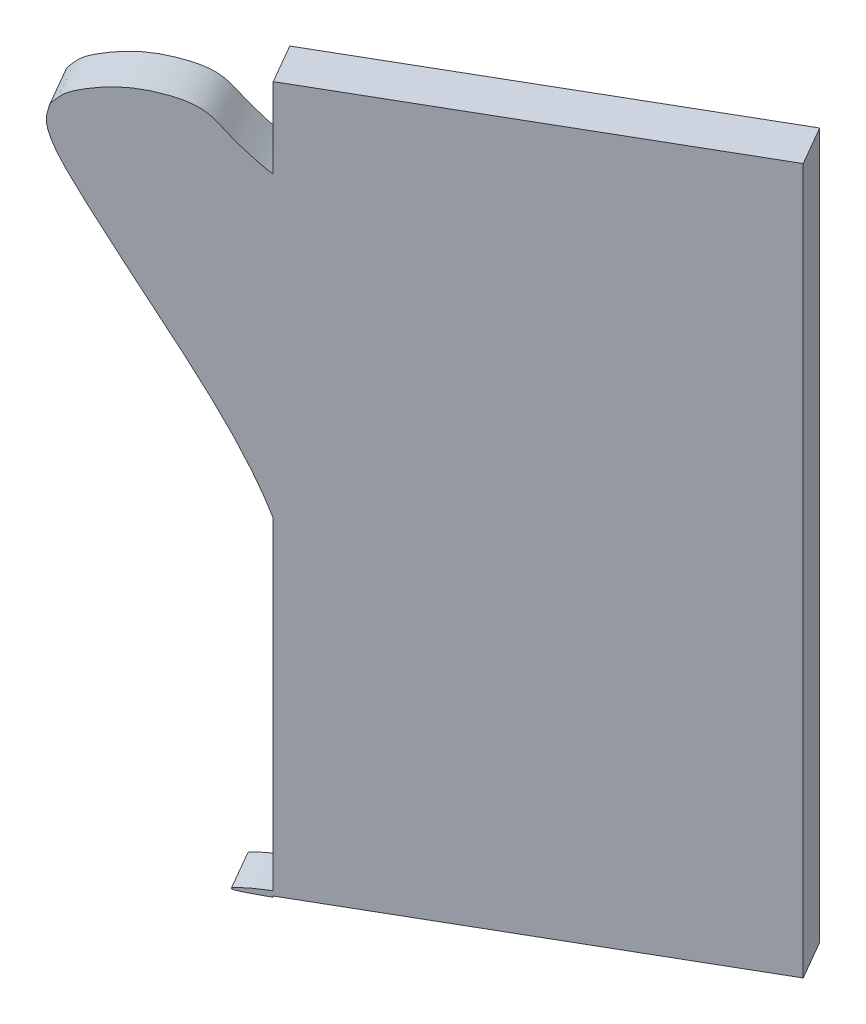
ISO-10303-21;
HEADER;
FILE_DESCRIPTION(('STEP AP214'),'2;1');
FILE_NAME('part.step','',(''),(''),'','','');
FILE_SCHEMA(('AUTOMOTIVE_DESIGN { 1 0 10303 214 1 1 1 1 }'));
ENDSEC;
DATA;
#1=APPLICATION_CONTEXT('core data for automotive mechanical design processes');
#2=APPLICATION_PROTOCOL_DEFINITION('international standard','automotive_design',2000,#1);
#3=PRODUCT_CONTEXT('',#1,'mechanical');
#4=PRODUCT('Part','Part','',(#3));
#5=PRODUCT_RELATED_PRODUCT_CATEGORY('part','',(#4));
#6=PRODUCT_DEFINITION_FORMATION('','',#4);
#7=PRODUCT_DEFINITION_CONTEXT('part definition',#1,'design');
#8=PRODUCT_DEFINITION('design','',#6,#7);
#9=PRODUCT_DEFINITION_SHAPE('','',#8);
#10=(LENGTH_UNIT() NAMED_UNIT(*) SI_UNIT(.MILLI.,.METRE.));
#11=(NAMED_UNIT(*) PLANE_ANGLE_UNIT() SI_UNIT($,.RADIAN.));
#12=(NAMED_UNIT(*) SI_UNIT($,.STERADIAN.) SOLID_ANGLE_UNIT());
#13=UNCERTAINTY_MEASURE_WITH_UNIT(LENGTH_MEASURE(1.E-05),#10,'distance_accuracy_value','');
#14=(GEOMETRIC_REPRESENTATION_CONTEXT(3) GLOBAL_UNCERTAINTY_ASSIGNED_CONTEXT((#13)) GLOBAL_UNIT_ASSIGNED_CONTEXT((#10,
#11,#12)) REPRESENTATION_CONTEXT('',''));
#15=CARTESIAN_POINT('',(0.,0.,0.));
#16=DIRECTION('',(0.,0.,1.));
#17=DIRECTION('',(1.,0.,0.));
#18=AXIS2_PLACEMENT_3D('',#15,#16,#17);
#19=CARTESIAN_POINT('',(-7.80159971962486,-123.736,13.9842601094867));
#20=DIRECTION('',(0.866024507379608,0.,-0.500001552615496));
#21=DIRECTION('',(-0.500001552615496,0.,-0.866024507379608));
#22=AXIS2_PLACEMENT_3D('',#19,#20,#21);
#23=PLANE('',#22);
#24=DIRECTION('',(0.,-1.,0.));
#25=VECTOR('',#24,1.);
#26=CARTESIAN_POINT('',(-11.8016121405488,-123.736,7.05606405044983));
#27=LINE('',#26,#25);
#28=CARTESIAN_POINT('',(-11.8016121405488,1.25599999999999,7.05606405044983));
#29=VERTEX_POINT('',#28);
#30=CARTESIAN_POINT('',(-11.8016121405488,-123.736,7.05606405044983));
#31=VERTEX_POINT('',#30);
#32=EDGE_CURVE('E159',#29,#31,#27,.T.);
#33=ORIENTED_EDGE('',*,*,#32,.F.);
#34=DIRECTION('',(-0.500001552615496,0.,-0.866024507379608));
#35=VECTOR('',#34,1.);
#36=CARTESIAN_POINT('',(-7.80159971962485,1.25599999999999,13.9842601094867));
#37=LINE('',#36,#35);
#38=CARTESIAN_POINT('',(-7.80159971962485,1.25599999999999,13.9842601094867));
#39=VERTEX_POINT('',#38);
#40=EDGE_CURVE('E11',#39,#29,#37,.T.);
#41=ORIENTED_EDGE('',*,*,#40,.F.);
#42=DIRECTION('',(0.,-1.,0.));
#43=VECTOR('',#42,1.);
#44=CARTESIAN_POINT('',(-7.80159971962486,-123.736,13.9842601094867));
#45=LINE('',#44,#43);
#46=CARTESIAN_POINT('',(-7.80159971962486,-123.736,13.9842601094867));
#47=VERTEX_POINT('',#46);
#48=EDGE_CURVE('E168',#39,#47,#45,.T.);
#49=ORIENTED_EDGE('',*,*,#48,.T.);
#50=DIRECTION('',(-0.500001552615496,0.,-0.866024507379608));
#51=VECTOR('',#50,1.);
#52=CARTESIAN_POINT('',(-7.80159971962486,-123.736,13.9842601094867));
#53=LINE('',#52,#51);
#54=EDGE_CURVE('E87',#47,#31,#53,.T.);
#55=ORIENTED_EDGE('',*,*,#54,.T.);
#56=EDGE_LOOP('',(#33,#41,#49,#55));
#57=FACE_BOUND('',#56,.T.);
#58=ADVANCED_FACE('F31',(#57),#23,.T.);
#59=CARTESIAN_POINT('',(-67.3420265676883,1.25599999999988,48.360083904011));
#60=DIRECTION('',(0.,1.,0.));
#61=DIRECTION('',(-1.,0.,0.));
#62=AXIS2_PLACEMENT_3D('',#59,#60,#61);
#63=PLANE('',#62);
#64=DIRECTION('',(0.866024507379608,0.,-0.500001552615496));
#65=VECTOR('',#64,1.);
#66=CARTESIAN_POINT('',(-71.3420389886123,1.25599999999988,41.4318878449741));
#67=LINE('',#66,#65);
#68=CARTESIAN_POINT('',(-71.3420389886123,1.25599999999988,41.4318878449741));
#69=VERTEX_POINT('',#68);
#70=EDGE_CURVE('E166',#69,#29,#67,.T.);
#71=ORIENTED_EDGE('',*,*,#70,.F.);
#72=DIRECTION('',(-0.500001552615496,0.,-0.866024507379608));
#73=VECTOR('',#72,1.);
#74=CARTESIAN_POINT('',(-67.3420265676883,1.25599999999988,48.360083904011));
#75=LINE('',#74,#73);
#76=CARTESIAN_POINT('',(-67.3420265676883,1.25599999999988,48.360083904011));
#77=VERTEX_POINT('',#76);
#78=EDGE_CURVE('E40',#77,#69,#75,.T.);
#79=ORIENTED_EDGE('',*,*,#78,.F.);
#80=DIRECTION('',(0.866024507379608,0.,-0.500001552615496));
#81=VECTOR('',#80,1.);
#82=CARTESIAN_POINT('',(-67.3420265676883,1.25599999999988,48.360083904011));
#83=LINE('',#82,#81);
#84=EDGE_CURVE('E120',#77,#39,#83,.T.);
#85=ORIENTED_EDGE('',*,*,#84,.T.);
#86=ORIENTED_EDGE('',*,*,#40,.T.);
#87=EDGE_LOOP('',(#71,#79,#85,#86));
#88=FACE_BOUND('',#87,.T.);
#89=ADVANCED_FACE('F179',(#88),#63,.T.);
#90=CARTESIAN_POINT('',(-67.3420265676883,1.25599999999988,48.360083904011));
#91=DIRECTION('',(-0.866024507372382,4.08507005165982E-06,0.500001552611324));
#92=DIRECTION('',(0.500001552615496,0.,0.866024507379608));
#93=AXIS2_PLACEMENT_3D('',#90,#91,#92);
#94=PLANE('',#93);
#95=DIRECTION('',(3.53777077892983E-06,0.999999999991656,-2.04254136866752E-06));
#96=VECTOR('',#95,1.);
#97=CARTESIAN_POINT('',(-71.3420389886123,1.25599999999988,41.4318878449741));
#98=LINE('',#97,#96);
#99=CARTESIAN_POINT('',(-71.3420891697741,-12.9284017038005,41.4319168172014));
#100=VERTEX_POINT('',#99);
#101=EDGE_CURVE('E106',#100,#69,#98,.T.);
#102=ORIENTED_EDGE('',*,*,#101,.F.);
#103=DIRECTION('',(-0.500001552615496,0.,-0.866024507379608));
#104=VECTOR('',#103,1.);
#105=CARTESIAN_POINT('',(-67.3420767488501,-12.9284017038005,48.3601128762382));
#106=LINE('',#105,#104);
#107=CARTESIAN_POINT('',(-67.3420767488501,-12.9284017038005,48.3601128762382));
#108=VERTEX_POINT('',#107);
#109=EDGE_CURVE('E101',#108,#100,#106,.T.);
#110=ORIENTED_EDGE('',*,*,#109,.F.);
#111=DIRECTION('',(3.53777077892983E-06,0.999999999991656,-2.04254136866752E-06));
#112=VECTOR('',#111,1.);
#113=CARTESIAN_POINT('',(-67.3420265676883,1.25599999999988,48.360083904011));
#114=LINE('',#113,#112);
#115=EDGE_CURVE('E104',#108,#77,#114,.T.);
#116=ORIENTED_EDGE('',*,*,#115,.T.);
#117=ORIENTED_EDGE('',*,*,#78,.T.);
#118=EDGE_LOOP('',(#102,#110,#116,#117));
#119=FACE_BOUND('',#118,.T.);
#120=ADVANCED_FACE('F103',(#119),#94,.T.);
#121=CARTESIAN_POINT('',(-67.3420756421798,-65.7361669443501,48.3601122372991));
#122=CARTESIAN_POINT('',(-67.431164461577,-65.451218631896,48.4115479041189));
#123=CARTESIAN_POINT('',(-67.5874033478989,-64.951492546195,48.50175284067));
#124=CARTESIAN_POINT('',(-67.7960017053032,-64.3133249503911,48.6221876571058));
#125=CARTESIAN_POINT('',(-67.9362427234235,-63.8929260686776,48.7031561819027));
#126=CARTESIAN_POINT('',(-68.1847475317985,-63.1578564438929,48.8466310939418));
#127=CARTESIAN_POINT('',(-68.5524904449656,-62.1079804291821,49.0589484429083));
#128=CARTESIAN_POINT('',(-69.2928172401877,-60.1042030594908,49.4863780871038));
#129=CARTESIAN_POINT('',(-70.2347198737805,-57.7299014818252,50.0301880776941));
#130=CARTESIAN_POINT('',(-71.8574131102836,-53.9333368409619,50.9670543335061));
#131=CARTESIAN_POINT('',(-74.0101449277621,-49.3238445076622,52.2099397737357));
#132=CARTESIAN_POINT('',(-76.7817139360927,-43.829981660768,53.8101125119638));
#133=CARTESIAN_POINT('',(-79.6381812541781,-38.388219191096,55.4593015151244));
#134=CARTESIAN_POINT('',(-82.523771347946,-32.9639011484721,57.1253046302804));
#135=CARTESIAN_POINT('',(-84.913049517912,-28.4323578500535,58.5047607362376));
#136=CARTESIAN_POINT('',(-86.7978958270955,-24.7888465562424,59.5929817657843));
#137=CARTESIAN_POINT('',(-88.1967621624815,-22.0460791941714,60.4006209649461));
#138=CARTESIAN_POINT('',(-89.5732396567543,-19.2874595577499,61.1953339071458));
#139=CARTESIAN_POINT('',(-90.6895876792831,-16.9389106717297,61.8398604069934));
#140=CARTESIAN_POINT('',(-91.5131220014424,-15.0390088715799,62.315330138165));
#141=CARTESIAN_POINT('',(-92.0279280667775,-13.6995914268009,62.6125547891651));
#142=CARTESIAN_POINT('',(-92.4094064457965,-12.5156733293427,62.8328023458721));
#143=CARTESIAN_POINT('',(-92.6613439777035,-11.4928418113067,62.978259149972));
#144=CARTESIAN_POINT('',(-92.7925554153252,-10.7074867240512,63.054014422453));
#145=CARTESIAN_POINT('',(-92.8400696911464,-10.136827342724,63.0814469159674));
#146=CARTESIAN_POINT('',(-92.8481528130349,-9.74227786700216,63.0861137278876));
#147=CARTESIAN_POINT('',(-92.8235982813292,-9.35296191179854,63.071937103702));
#148=CARTESIAN_POINT('',(-92.7629936123318,-8.96552650808315,63.0369468368722));
#149=CARTESIAN_POINT('',(-92.6771740983495,-8.58195146519589,62.9873987122288));
#150=CARTESIAN_POINT('',(-92.6063811953025,-8.2640926206948,62.9465262413737));
#151=CARTESIAN_POINT('',(-92.5590814232452,-8.00750267602608,62.9192175921778));
#152=CARTESIAN_POINT('',(-92.5246880345011,-7.81532549239653,62.8993604777137));
#153=CARTESIAN_POINT('',(-92.4864652736864,-7.62440543302388,62.8772924651001));
#154=CARTESIAN_POINT('',(-92.406511628792,-7.37755261768767,62.8311310155755));
#155=CARTESIAN_POINT('',(-92.2261327983711,-7.11914383634141,62.7269888180962));
#156=CARTESIAN_POINT('',(-91.9119900593846,-6.74514276277732,62.5456176722479));
#157=CARTESIAN_POINT('',(-91.6059879583642,-6.35654626198646,62.3689465453802));
#158=CARTESIAN_POINT('',(-91.2838695314428,-5.99008063246047,62.1829706148906));
#159=CARTESIAN_POINT('',(-91.0312868782548,-5.73526836828086,62.0371413483033));
#160=CARTESIAN_POINT('',(-90.7602453102027,-5.50798808937124,61.880654778126));
#161=CARTESIAN_POINT('',(-90.3115635767804,-5.18863350779232,61.6216071860201));
#162=CARTESIAN_POINT('',(-89.6660051651095,-4.83016378530899,61.2488923201139));
#163=CARTESIAN_POINT('',(-88.8383108263291,-4.44193650460184,60.7710207922822));
#164=CARTESIAN_POINT('',(-87.8596084598043,-4.05679103015307,60.205964378011));
#165=CARTESIAN_POINT('',(-86.7248371677206,-3.68195684877983,59.5508011544873));
#166=CARTESIAN_POINT('',(-85.4233844152864,-3.35054780391245,58.799403946524));
#167=CARTESIAN_POINT('',(-84.1008414750659,-3.12095580018445,58.0358302625509));
#168=CARTESIAN_POINT('',(-82.7416550056475,-3.01616125819886,57.2511003395381));
#169=CARTESIAN_POINT('',(-81.4050813495517,-3.03370522773666,56.4794259844382));
#170=CARTESIAN_POINT('',(-80.0658275404745,-3.15446372046908,55.7062042358863));
#171=CARTESIAN_POINT('',(-78.7662445595598,-3.35593363823789,54.9558865454827));
#172=CARTESIAN_POINT('',(-77.4556115454354,-3.66913774235238,54.1991890890167));
#173=CARTESIAN_POINT('',(-76.4064865930361,-4.05805929421772,53.5934740074949));
#174=CARTESIAN_POINT('',(-75.5947423619504,-4.49299426628403,53.1248113167616));
#175=CARTESIAN_POINT('',(-75.0327164275306,-4.87407242279179,52.8003241487594));
#176=CARTESIAN_POINT('',(-74.482577278702,-5.33461100706394,52.4826998480325));
#177=CARTESIAN_POINT('',(-73.9846717465959,-5.84472579742825,52.1952327648408));
#178=CARTESIAN_POINT('',(-73.4997796918512,-6.40961117930446,51.9152790474145));
#179=CARTESIAN_POINT('',(-73.0388687682059,-6.98199104838376,51.6491708998086));
#180=CARTESIAN_POINT('',(-72.5868975070891,-7.55775210383137,51.3882240901394));
#181=CARTESIAN_POINT('',(-71.9847836573425,-8.31467014451526,51.0405920576055));
#182=CARTESIAN_POINT('',(-71.2060921407275,-9.21699208509249,50.5910124394788));
#183=CARTESIAN_POINT('',(-70.2207861311853,-10.2548307069531,50.0221433943486));
#184=CARTESIAN_POINT('',(-69.3831162096275,-11.1100181440636,49.5385124372692));
#185=CARTESIAN_POINT('',(-68.704145480113,-11.7716158454457,49.1465068807926));
#186=CARTESIAN_POINT('',(-68.217526724756,-12.2181750908973,48.8655562481753));
#187=CARTESIAN_POINT('',(-67.7683913262646,-12.6028113709584,48.6062467313353));
#188=CARTESIAN_POINT('',(-67.4811436236738,-12.8221918004569,48.4404035062801));
#189=CARTESIAN_POINT('',(-67.3420767488501,-12.9284017038005,48.3601128762382));
#190=B_SPLINE_CURVE_WITH_KNOTS('',3,(#121,#122,#123,#124,#125,#126,#127,#128,#129,#130,#131,
#132,#133,#134,#135,#136,#137,#138,#139,#140,#141,#142,#143,#144,#145,#146,#147,#148,#149,#150,
#151,#152,#153,#154,#155,#156,#157,#158,#159,#160,#161,#162,#163,#164,#165,#166,#167,#168,#169,
#170,#171,#172,#173,#174,#175,#176,#177,#178,#179,#180,#181,#182,#183,#184,#185,#186,#187,#188,
#189),.UNSPECIFIED.,.F.,.F.,(4,1,1,1,1,1,1,1,1,1,1,1,1,1,1,1,1,1,1,1,1,1,1,1,1,1,1,1,1,1,1,1,1,
1,1,1,1,1,1,1,1,1,1,1,1,1,1,1,1,1,1,1,1,1,1,1,1,1,1,1,1,1,1,1,1,1,4),(0.,0.0091352541188192,
0.0160208872386926,0.0205684462904706,0.0227202626544557,0.0398158621405215,0.0547157248065927,
0.0884105410567434,0.118549822903418,0.182372892622548,0.246280204692864,0.310260199405642,
0.374254407939423,0.438245598646914,0.470239330994021,0.502232855701898,0.534229082306538,
0.566244328431484,0.583001776809653,0.59828226473814,0.61041168397323,0.621061191604272,
0.630317537550296,0.6344811245637,0.63833666245438,0.642205015602925,0.646230220744784,
0.650189683974899,0.654149993059116,0.656125302317133,0.658099644693582,0.660067548253725,
0.662033496492281,0.665989022744382,0.669923285620493,0.67779194309442,0.681801486742994,
0.685666582089982,0.689457838465289,0.693450862502852,0.70400503422949,0.714345079528632,
0.724550748976496,0.739991726060577,0.755418893707979,0.770925522257178,0.786514408820659,
0.802798325252978,0.81742295669543,0.83326617270852,0.8484244593279,0.86398345044006,
0.871494146282318,0.879545704602829,0.886636882488123,0.895121564278253,0.902689623703838,
0.910615335332813,0.918687993347706,0.926123076874961,0.941606421797599,0.957078826337664,
0.972554574884432,0.980537491359971,0.988010102499361,0.994195262277709,1.),.UNSPECIFIED.);
#191=DIRECTION('',(-0.500001552615496,0.,-0.866024507379608));
#192=VECTOR('',#191,1.);
#193=SURFACE_OF_LINEAR_EXTRUSION('',#190,#192);
#194=CARTESIAN_POINT('',(-71.3420891697741,-12.9284017038005,41.4319168172013));
#195=CARTESIAN_POINT('',(-71.4811560445978,-12.8221918004569,41.5122074472432));
#196=CARTESIAN_POINT('',(-71.7684037471886,-12.6028113709584,41.6780506722984));
#197=CARTESIAN_POINT('',(-72.21753914568,-12.2181750908973,41.9373601891384));
#198=CARTESIAN_POINT('',(-72.704157901037,-11.7716158454457,42.2183108217557));
#199=CARTESIAN_POINT('',(-73.3831286305515,-11.1100181440636,42.6103163782323));
#200=CARTESIAN_POINT('',(-74.2207985521093,-10.2548307069531,43.0939473353117));
#201=CARTESIAN_POINT('',(-75.2061045616515,-9.21699208509249,43.6628163804419));
#202=CARTESIAN_POINT('',(-75.9847960782665,-8.31467014451526,44.1123959985686));
#203=CARTESIAN_POINT('',(-76.5869099280131,-7.55775210383137,44.4600280311025));
#204=CARTESIAN_POINT('',(-77.0388811891299,-6.98199104838376,44.7209748407717));
#205=CARTESIAN_POINT('',(-77.4997921127752,-6.40961117930446,44.9870829883776));
#206=CARTESIAN_POINT('',(-77.9846841675198,-5.84472579742825,45.2670367058039));
#207=CARTESIAN_POINT('',(-78.482589699626,-5.33461100706394,45.5545037889956));
#208=CARTESIAN_POINT('',(-79.0327288484546,-4.87407242279179,45.8721280897225));
#209=CARTESIAN_POINT('',(-79.5947547828743,-4.49299426628403,46.1966152577247));
#210=CARTESIAN_POINT('',(-80.40649901396,-4.05805929421772,46.665277948458));
#211=CARTESIAN_POINT('',(-81.4556239663594,-3.66913774235238,47.2709930299798));
#212=CARTESIAN_POINT('',(-82.7662569804838,-3.35593363823789,48.0276904864458));
#213=CARTESIAN_POINT('',(-84.0658399613985,-3.15446372046908,48.7780081768494));
#214=CARTESIAN_POINT('',(-85.4050937704757,-3.03370522773666,49.5512299254013));
#215=CARTESIAN_POINT('',(-86.7416674265715,-3.01616125819886,50.3229042805012));
#216=CARTESIAN_POINT('',(-88.1008538959899,-3.12095580018445,51.107634203514));
#217=CARTESIAN_POINT('',(-89.4233968362104,-3.35054780391245,51.8712078874871));
#218=CARTESIAN_POINT('',(-90.7248495886446,-3.68195684877983,52.6226050954504));
#219=CARTESIAN_POINT('',(-91.8596208807283,-4.05679103015307,53.2777683189741));
#220=CARTESIAN_POINT('',(-92.8383232472531,-4.44193650460184,53.8428247332453));
#221=CARTESIAN_POINT('',(-93.6660175860335,-4.83016378530899,54.320696261077));
#222=CARTESIAN_POINT('',(-94.3115759977044,-5.18863350779232,54.6934111269832));
#223=CARTESIAN_POINT('',(-94.7602577311267,-5.50798808937124,54.9524587190891));
#224=CARTESIAN_POINT('',(-95.0312992991788,-5.73526836828086,55.1089452892664));
#225=CARTESIAN_POINT('',(-95.2838819523668,-5.99008063246047,55.2547745558537));
#226=CARTESIAN_POINT('',(-95.6060003792882,-6.35654626198646,55.4407504863433));
#227=CARTESIAN_POINT('',(-95.9120024803086,-6.74514276277732,55.617421613211));
#228=CARTESIAN_POINT('',(-96.2261452192951,-7.11914383634141,55.7987927590593));
#229=CARTESIAN_POINT('',(-96.406524049716,-7.37755261768767,55.9029349565386));
#230=CARTESIAN_POINT('',(-96.4864776946104,-7.62440543302388,55.9490964060632));
#231=CARTESIAN_POINT('',(-96.5247004554251,-7.81532549239653,55.9711644186768));
#232=CARTESIAN_POINT('',(-96.5590938441692,-8.00750267602608,55.9910215331409));
#233=CARTESIAN_POINT('',(-96.6063936162265,-8.2640926206948,56.0183301823368));
#234=CARTESIAN_POINT('',(-96.6771865192735,-8.58195146519589,56.0592026531919));
#235=CARTESIAN_POINT('',(-96.7630060332558,-8.96552650808315,56.1087507778352));
#236=CARTESIAN_POINT('',(-96.8236107022532,-9.35296191179854,56.1437410446651));
#237=CARTESIAN_POINT('',(-96.8481652339589,-9.74227786700216,56.1579176688507));
#238=CARTESIAN_POINT('',(-96.8400821120704,-10.136827342724,56.1532508569305));
#239=CARTESIAN_POINT('',(-96.7925678362492,-10.7074867240512,56.1258183634161));
#240=CARTESIAN_POINT('',(-96.6613563986275,-11.4928418113067,56.0500630909351));
#241=CARTESIAN_POINT('',(-96.4094188667205,-12.5156733293427,55.9046062868352));
#242=CARTESIAN_POINT('',(-96.0279404877015,-13.6995914268009,55.6843587301282));
#243=CARTESIAN_POINT('',(-95.5131344223664,-15.0390088715799,55.3871340791281));
#244=CARTESIAN_POINT('',(-94.6896001002071,-16.9389106717297,54.9116643479565));
#245=CARTESIAN_POINT('',(-93.5732520776782,-19.2874595577499,54.2671378481088));
#246=CARTESIAN_POINT('',(-92.1967745834055,-22.0460791941714,53.4724249059092));
#247=CARTESIAN_POINT('',(-90.7979082480195,-24.7888465562424,52.6647857067474));
#248=CARTESIAN_POINT('',(-88.913061938836,-28.4323578500535,51.5765646772007));
#249=CARTESIAN_POINT('',(-86.5237837688699,-32.9639011484721,50.1971085712435));
#250=CARTESIAN_POINT('',(-83.638193675102,-38.388219191096,48.5311054560875));
#251=CARTESIAN_POINT('',(-80.7817263570167,-43.829981660768,46.8819164529269));
#252=CARTESIAN_POINT('',(-78.0101573486861,-49.3238445076622,45.2817437146987));
#253=CARTESIAN_POINT('',(-75.8574255312075,-53.9333368409619,44.0388582744692));
#254=CARTESIAN_POINT('',(-74.2347322947045,-57.7299014818252,43.1019920186572));
#255=CARTESIAN_POINT('',(-73.2928296611117,-60.1042030594908,42.5581820280669));
#256=CARTESIAN_POINT('',(-72.5525028658896,-62.1079804291821,42.1307523838714));
#257=CARTESIAN_POINT('',(-72.1847599527225,-63.1578564438929,41.9184350349049));
#258=CARTESIAN_POINT('',(-71.9362551443475,-63.8929260686776,41.7749601228658));
#259=CARTESIAN_POINT('',(-71.7960141262272,-64.3133249503911,41.6939915980689));
#260=CARTESIAN_POINT('',(-71.5874157688229,-64.951492546195,41.573556781633));
#261=CARTESIAN_POINT('',(-71.431176882501,-65.451218631896,41.483351845082));
#262=CARTESIAN_POINT('',(-71.3420880631038,-65.7361669443501,41.4319161782622));
#263=B_SPLINE_CURVE_WITH_KNOTS('',3,(#194,#195,#196,#197,#198,#199,#200,#201,#202,#203,#204,
#205,#206,#207,#208,#209,#210,#211,#212,#213,#214,#215,#216,#217,#218,#219,#220,#221,#222,#223,
#224,#225,#226,#227,#228,#229,#230,#231,#232,#233,#234,#235,#236,#237,#238,#239,#240,#241,#242,
#243,#244,#245,#246,#247,#248,#249,#250,#251,#252,#253,#254,#255,#256,#257,#258,#259,#260,#261,
#262),.UNSPECIFIED.,.F.,.F.,(4,1,1,1,1,1,1,1,1,1,1,1,1,1,1,1,1,1,1,1,1,1,1,1,1,1,1,1,1,1,1,1,1,
1,1,1,1,1,1,1,1,1,1,1,1,1,1,1,1,1,1,1,1,1,1,1,1,1,1,1,1,1,1,1,1,1,4),(0.,0.00580473772229062,
0.0119898975006392,0.0194625086400287,0.0274454251155679,0.0429211736623358,0.0583935782024014,
0.0738769231250388,0.0813120066522943,0.0893846646671871,0.0973103762961621,0.104878435721747,
0.113363117511877,0.120454295397171,0.128505853717682,0.13601654955994,0.1515755406721,
0.16673382729148,0.18257704330457,0.197201674747022,0.213485591179341,0.229074477742822,
0.244581106292021,0.260008273939423,0.275449251023504,0.285654920471368,0.29599496577051,
0.306549137497148,0.310542161534711,0.314333417910018,0.318198513257006,0.32220805690558,
0.330076714379507,0.334010977255618,0.337966503507719,0.339932451746275,0.341900355306418,
0.343874697682867,0.345850006940884,0.349810316025101,0.353769779255216,0.357794984397075,
0.36166333754562,0.3655188754363,0.369682462449704,0.378938808395728,0.38958831602677,
0.40171773526186,0.416998223190347,0.433755671568516,0.465770917693462,0.497767144298102,
0.529760669005979,0.561754401353086,0.625745592060577,0.689739800594358,0.753719795307136,
0.817627107377452,0.881450177096582,0.911589458943257,0.945284275193407,0.960184137859478,
0.977279737345544,0.979431553709529,0.983979112761307,0.990864745881181,1.),.UNSPECIFIED.);
#264=CARTESIAN_POINT('',(-71.3420880631038,-65.7361669443501,41.4319161782623));
#265=VERTEX_POINT('',#264);
#266=EDGE_CURVE('E273',#265,#100,#263,.F.);
#267=ORIENTED_EDGE('',*,*,#266,.F.);
#268=DIRECTION('',(-0.500001552615496,0.,-0.866024507379608));
#269=VECTOR('',#268,1.);
#270=CARTESIAN_POINT('',(-67.3420756421798,-65.7361669443501,48.3601122372991));
#271=LINE('',#270,#269);
#272=CARTESIAN_POINT('',(-67.3420756421798,-65.7361669443501,48.3601122372991));
#273=VERTEX_POINT('',#272);
#274=EDGE_CURVE('E111',#273,#265,#271,.T.);
#275=ORIENTED_EDGE('',*,*,#274,.F.);
#276=CARTESIAN_POINT('',(-67.3420756421798,-65.7361669443501,48.3601122372991));
#277=CARTESIAN_POINT('',(-67.431164461577,-65.451218631896,48.4115479041189));
#278=CARTESIAN_POINT('',(-67.5874033478989,-64.951492546195,48.50175284067));
#279=CARTESIAN_POINT('',(-67.7960017053032,-64.3133249503911,48.6221876571058));
#280=CARTESIAN_POINT('',(-67.9362427234235,-63.8929260686776,48.7031561819027));
#281=CARTESIAN_POINT('',(-68.1847475317985,-63.1578564438929,48.8466310939418));
#282=CARTESIAN_POINT('',(-68.5524904449656,-62.1079804291821,49.0589484429083));
#283=CARTESIAN_POINT('',(-69.2928172401877,-60.1042030594908,49.4863780871038));
#284=CARTESIAN_POINT('',(-70.2347198737805,-57.7299014818252,50.0301880776941));
#285=CARTESIAN_POINT('',(-71.8574131102836,-53.9333368409619,50.9670543335061));
#286=CARTESIAN_POINT('',(-74.0101449277621,-49.3238445076622,52.2099397737357));
#287=CARTESIAN_POINT('',(-76.7817139360927,-43.829981660768,53.8101125119638));
#288=CARTESIAN_POINT('',(-79.6381812541781,-38.388219191096,55.4593015151244));
#289=CARTESIAN_POINT('',(-82.523771347946,-32.9639011484721,57.1253046302804));
#290=CARTESIAN_POINT('',(-84.913049517912,-28.4323578500535,58.5047607362376));
#291=CARTESIAN_POINT('',(-86.7978958270955,-24.7888465562424,59.5929817657843));
#292=CARTESIAN_POINT('',(-88.1967621624815,-22.0460791941714,60.4006209649461));
#293=CARTESIAN_POINT('',(-89.5732396567543,-19.2874595577499,61.1953339071458));
#294=CARTESIAN_POINT('',(-90.6895876792831,-16.9389106717297,61.8398604069934));
#295=CARTESIAN_POINT('',(-91.5131220014424,-15.0390088715799,62.315330138165));
#296=CARTESIAN_POINT('',(-92.0279280667775,-13.6995914268009,62.6125547891651));
#297=CARTESIAN_POINT('',(-92.4094064457965,-12.5156733293427,62.8328023458721));
#298=CARTESIAN_POINT('',(-92.6613439777035,-11.4928418113067,62.978259149972));
#299=CARTESIAN_POINT('',(-92.7925554153252,-10.7074867240512,63.054014422453));
#300=CARTESIAN_POINT('',(-92.8400696911464,-10.136827342724,63.0814469159674));
#301=CARTESIAN_POINT('',(-92.8481528130349,-9.74227786700216,63.0861137278876));
#302=CARTESIAN_POINT('',(-92.8235982813292,-9.35296191179854,63.071937103702));
#303=CARTESIAN_POINT('',(-92.7629936123318,-8.96552650808315,63.0369468368722));
#304=CARTESIAN_POINT('',(-92.6771740983495,-8.58195146519589,62.9873987122288));
#305=CARTESIAN_POINT('',(-92.6063811953025,-8.2640926206948,62.9465262413737));
#306=CARTESIAN_POINT('',(-92.5590814232452,-8.00750267602608,62.9192175921778));
#307=CARTESIAN_POINT('',(-92.5246880345011,-7.81532549239653,62.8993604777137));
#308=CARTESIAN_POINT('',(-92.4864652736864,-7.62440543302388,62.8772924651001));
#309=CARTESIAN_POINT('',(-92.406511628792,-7.37755261768767,62.8311310155755));
#310=CARTESIAN_POINT('',(-92.2261327983711,-7.11914383634141,62.7269888180962));
#311=CARTESIAN_POINT('',(-91.9119900593846,-6.74514276277732,62.5456176722479));
#312=CARTESIAN_POINT('',(-91.6059879583642,-6.35654626198646,62.3689465453802));
#313=CARTESIAN_POINT('',(-91.2838695314428,-5.99008063246047,62.1829706148906));
#314=CARTESIAN_POINT('',(-91.0312868782548,-5.73526836828086,62.0371413483033));
#315=CARTESIAN_POINT('',(-90.7602453102027,-5.50798808937124,61.880654778126));
#316=CARTESIAN_POINT('',(-90.3115635767804,-5.18863350779232,61.6216071860201));
#317=CARTESIAN_POINT('',(-89.6660051651095,-4.83016378530899,61.2488923201139));
#318=CARTESIAN_POINT('',(-88.8383108263291,-4.44193650460184,60.7710207922822));
#319=CARTESIAN_POINT('',(-87.8596084598043,-4.05679103015307,60.205964378011));
#320=CARTESIAN_POINT('',(-86.7248371677206,-3.68195684877983,59.5508011544873));
#321=CARTESIAN_POINT('',(-85.4233844152864,-3.35054780391245,58.799403946524));
#322=CARTESIAN_POINT('',(-84.1008414750659,-3.12095580018445,58.0358302625509));
#323=CARTESIAN_POINT('',(-82.7416550056475,-3.01616125819886,57.2511003395381));
#324=CARTESIAN_POINT('',(-81.4050813495517,-3.03370522773666,56.4794259844382));
#325=CARTESIAN_POINT('',(-80.0658275404745,-3.15446372046908,55.7062042358863));
#326=CARTESIAN_POINT('',(-78.7662445595598,-3.35593363823789,54.9558865454827));
#327=CARTESIAN_POINT('',(-77.4556115454354,-3.66913774235238,54.1991890890167));
#328=CARTESIAN_POINT('',(-76.4064865930361,-4.05805929421772,53.5934740074949));
#329=CARTESIAN_POINT('',(-75.5947423619504,-4.49299426628403,53.1248113167616));
#330=CARTESIAN_POINT('',(-75.0327164275306,-4.87407242279179,52.8003241487594));
#331=CARTESIAN_POINT('',(-74.482577278702,-5.33461100706394,52.4826998480325));
#332=CARTESIAN_POINT('',(-73.9846717465959,-5.84472579742825,52.1952327648408));
#333=CARTESIAN_POINT('',(-73.4997796918512,-6.40961117930446,51.9152790474145));
#334=CARTESIAN_POINT('',(-73.0388687682059,-6.98199104838376,51.6491708998086));
#335=CARTESIAN_POINT('',(-72.5868975070891,-7.55775210383137,51.3882240901394));
#336=CARTESIAN_POINT('',(-71.9847836573425,-8.31467014451526,51.0405920576055));
#337=CARTESIAN_POINT('',(-71.2060921407275,-9.21699208509249,50.5910124394788));
#338=CARTESIAN_POINT('',(-70.2207861311853,-10.2548307069531,50.0221433943486));
#339=CARTESIAN_POINT('',(-69.3831162096275,-11.1100181440636,49.5385124372692));
#340=CARTESIAN_POINT('',(-68.704145480113,-11.7716158454457,49.1465068807926));
#341=CARTESIAN_POINT('',(-68.217526724756,-12.2181750908973,48.8655562481753));
#342=CARTESIAN_POINT('',(-67.7683913262646,-12.6028113709584,48.6062467313353));
#343=CARTESIAN_POINT('',(-67.4811436236738,-12.8221918004569,48.4404035062801));
#344=CARTESIAN_POINT('',(-67.3420767488501,-12.9284017038005,48.3601128762382));
#345=B_SPLINE_CURVE_WITH_KNOTS('',3,(#276,#277,#278,#279,#280,#281,#282,#283,#284,#285,#286,
#287,#288,#289,#290,#291,#292,#293,#294,#295,#296,#297,#298,#299,#300,#301,#302,#303,#304,#305,
#306,#307,#308,#309,#310,#311,#312,#313,#314,#315,#316,#317,#318,#319,#320,#321,#322,#323,#324,
#325,#326,#327,#328,#329,#330,#331,#332,#333,#334,#335,#336,#337,#338,#339,#340,#341,#342,#343,
#344),.UNSPECIFIED.,.F.,.F.,(4,1,1,1,1,1,1,1,1,1,1,1,1,1,1,1,1,1,1,1,1,1,1,1,1,1,1,1,1,1,1,1,1,
1,1,1,1,1,1,1,1,1,1,1,1,1,1,1,1,1,1,1,1,1,1,1,1,1,1,1,1,1,1,1,1,1,4),(0.,0.0091352541188192,
0.0160208872386926,0.0205684462904706,0.0227202626544557,0.0398158621405215,0.0547157248065927,
0.0884105410567434,0.118549822903418,0.182372892622548,0.246280204692864,0.310260199405642,
0.374254407939423,0.438245598646914,0.470239330994021,0.502232855701898,0.534229082306538,
0.566244328431484,0.583001776809653,0.59828226473814,0.61041168397323,0.621061191604272,
0.630317537550296,0.6344811245637,0.63833666245438,0.642205015602925,0.646230220744784,
0.650189683974899,0.654149993059116,0.656125302317133,0.658099644693582,0.660067548253725,
0.662033496492281,0.665989022744382,0.669923285620493,0.67779194309442,0.681801486742994,
0.685666582089982,0.689457838465289,0.693450862502852,0.70400503422949,0.714345079528632,
0.724550748976496,0.739991726060577,0.755418893707979,0.770925522257178,0.786514408820659,
0.802798325252978,0.81742295669543,0.83326617270852,0.8484244593279,0.86398345044006,
0.871494146282318,0.879545704602829,0.886636882488123,0.895121564278253,0.902689623703838,
0.910615335332813,0.918687993347706,0.926123076874961,0.941606421797599,0.957078826337664,
0.972554574884432,0.980537491359971,0.988010102499361,0.994195262277709,1.),.UNSPECIFIED.);
#346=EDGE_CURVE('E117',#273,#108,#345,.T.);
#347=ORIENTED_EDGE('',*,*,#346,.T.);
#348=ORIENTED_EDGE('',*,*,#109,.T.);
#349=EDGE_LOOP('',(#267,#275,#347,#348));
#350=FACE_BOUND('',#349,.T.);
#351=ADVANCED_FACE('F123',(#350),#193,.T.);
#352=CARTESIAN_POINT('',(-67.3420756421798,-65.7361669443501,48.3601122372991));
#353=DIRECTION('',(-0.866024489553666,0.000202897245486059,0.500001542323641));
#354=DIRECTION('',(0.500001552615496,0.,0.866024507379608));
#355=AXIS2_PLACEMENT_3D('',#352,#353,#354);
#356=PLANE('',#355);
#357=DIRECTION('',(0.000175713987070784,0.999999979416354,-0.000101448937764367));
#358=VECTOR('',#357,1.);
#359=CARTESIAN_POINT('',(-71.3420880631038,-65.7361669443501,41.4319161782623));
#360=LINE('',#359,#358);
#361=CARTESIAN_POINT('',(-71.3521352269718,-122.915244311644,41.4377169350429));
#362=VERTEX_POINT('',#361);
#363=EDGE_CURVE('E274',#362,#265,#360,.T.);
#364=ORIENTED_EDGE('',*,*,#363,.F.);
#365=DIRECTION('',(-0.500001552615496,0.,-0.866024507379608));
#366=VECTOR('',#365,1.);
#367=CARTESIAN_POINT('',(-67.3521228060478,-122.915244311644,48.3659129940798));
#368=LINE('',#367,#366);
#369=CARTESIAN_POINT('',(-67.3521228060478,-122.915244311644,48.3659129940798));
#370=VERTEX_POINT('',#369);
#371=EDGE_CURVE('E173',#370,#362,#368,.T.);
#372=ORIENTED_EDGE('',*,*,#371,.F.);
#373=DIRECTION('',(0.000175713987070784,0.999999979416354,-0.000101448937764367));
#374=VECTOR('',#373,1.);
#375=CARTESIAN_POINT('',(-67.3420756421798,-65.7361669443501,48.3601122372991));
#376=LINE('',#375,#374);
#377=EDGE_CURVE('E124',#370,#273,#376,.T.);
#378=ORIENTED_EDGE('',*,*,#377,.T.);
#379=ORIENTED_EDGE('',*,*,#274,.T.);
#380=EDGE_LOOP('',(#364,#372,#378,#379));
#381=FACE_BOUND('',#380,.T.);
#382=ADVANCED_FACE('F142',(#381),#356,.T.);
#383=CARTESIAN_POINT('',(-67.3781630903883,-123.939872147786,48.3809474215006));
#384=CARTESIAN_POINT('',(-67.698122748117,-123.937074010713,48.5656769808553));
#385=CARTESIAN_POINT('',(-68.324361430402,-123.931597377545,48.9272375496178));
#386=CARTESIAN_POINT('',(-69.1598965092271,-123.912119819842,49.4096359495676));
#387=CARTESIAN_POINT('',(-69.8676855231041,-123.886365253657,49.8182798191661));
#388=CARTESIAN_POINT('',(-70.5027549986772,-123.853268206152,50.1849388699198));
#389=CARTESIAN_POINT('',(-71.0958188324398,-123.807691088524,50.5273458516559));
#390=CARTESIAN_POINT('',(-71.5354002566563,-123.753122257452,50.7811393560386));
#391=CARTESIAN_POINT('',(-71.7724345196817,-123.703715832278,50.9179917182129));
#392=CARTESIAN_POINT('',(-71.8690891355952,-123.678088463299,50.9737955177734));
#393=CARTESIAN_POINT('',(-71.9454435320416,-123.651720332284,51.0178789316339));
#394=CARTESIAN_POINT('',(-72.0017549151189,-123.624007531825,51.0503904584194));
#395=CARTESIAN_POINT('',(-72.0391077869677,-123.596291365866,51.0719562383251));
#396=CARTESIAN_POINT('',(-72.0590683120564,-123.561434441984,51.0834805005721));
#397=CARTESIAN_POINT('',(-72.0491934128394,-123.522760891915,51.0777792012459));
#398=CARTESIAN_POINT('',(-72.0180804522183,-123.491723320531,51.0598160506832));
#399=CARTESIAN_POINT('',(-71.9698651342584,-123.459851740768,51.0319788086256));
#400=CARTESIAN_POINT('',(-71.9015669115186,-123.427511653608,50.9925466480807));
#401=CARTESIAN_POINT('',(-71.8056738036758,-123.391273017114,50.9371825072302));
#402=CARTESIAN_POINT('',(-71.6786423371803,-123.352455221554,50.863840552196));
#403=CARTESIAN_POINT('',(-71.5177455598512,-123.311429169888,50.7709463698838));
#404=CARTESIAN_POINT('',(-71.3281419391418,-123.270078517184,50.6614782151972));
#405=CARTESIAN_POINT('',(-71.0832327423322,-123.223626245851,50.5200792390583));
#406=CARTESIAN_POINT('',(-70.786205824191,-123.174773714598,50.3485899578963));
#407=CARTESIAN_POINT('',(-70.4403007821691,-123.126282598994,50.1488807619155));
#408=CARTESIAN_POINT('',(-70.0756704157926,-123.082689993043,49.9383604501166));
#409=CARTESIAN_POINT('',(-69.4470604517842,-123.018815166374,49.5754308155445));
#410=CARTESIAN_POINT('',(-68.5373137341905,-122.951654313389,49.0501861285783));
#411=CARTESIAN_POINT('',(-67.754481166388,-122.927605078381,48.598215663535));
#412=CARTESIAN_POINT('',(-67.3521228060478,-122.915244311644,48.3659129940798));
#413=B_SPLINE_CURVE_WITH_KNOTS('',3,(#383,#384,#385,#386,#387,#388,#389,#390,#391,#392,#393,
#394,#395,#396,#397,#398,#399,#400,#401,#402,#403,#404,#405,#406,#407,#408,#409,#410,#411,#412),
.UNSPECIFIED.,.F.,.F.,(4,1,1,1,1,1,1,1,1,1,1,1,1,1,1,1,1,1,1,1,1,1,1,1,1,1,1,4),(0.,
0.101018809237323,0.19771831996533,0.263836405246628,0.324588624414711,0.398408046573414,
0.451501456253982,0.464016756276664,0.474434964791536,0.482792841917496,0.489161301256394,
0.493667970745693,0.496792925838257,0.499697098173785,0.503734758422504,0.509510452151175,
0.517230014587229,0.526976456923052,0.541360481039471,0.558691531185131,0.578990707378097,
0.602271357664356,0.637044646793467,0.67370490967263,0.712274883603329,0.752774003426364,
0.872931389538283,1.),.UNSPECIFIED.);
#414=DIRECTION('',(-0.500001552615496,0.,-0.866024507379608));
#415=VECTOR('',#414,1.);
#416=SURFACE_OF_LINEAR_EXTRUSION('',#413,#415);
#417=CARTESIAN_POINT('',(-71.3521352269717,-122.915244311644,41.4377169350431));
#418=CARTESIAN_POINT('',(-71.7544935873119,-122.927605078381,41.6700196044983));
#419=CARTESIAN_POINT('',(-72.5373261551144,-122.951654313389,42.1219900695415));
#420=CARTESIAN_POINT('',(-73.4470728727081,-123.018815166374,42.6472347565078));
#421=CARTESIAN_POINT('',(-74.0756828367165,-123.082689993043,43.0101643910799));
#422=CARTESIAN_POINT('',(-74.440313203093,-123.126282598994,43.2206847028787));
#423=CARTESIAN_POINT('',(-74.7862182451149,-123.174773714598,43.4203938988596));
#424=CARTESIAN_POINT('',(-75.0832451632562,-123.223626245851,43.5918831800216));
#425=CARTESIAN_POINT('',(-75.3281543600657,-123.270078517184,43.7332821561604));
#426=CARTESIAN_POINT('',(-75.5177579807751,-123.311429169888,43.842750310847));
#427=CARTESIAN_POINT('',(-75.6786547581043,-123.352455221554,43.9356444931593));
#428=CARTESIAN_POINT('',(-75.8056862245997,-123.391273017114,44.0089864481935));
#429=CARTESIAN_POINT('',(-75.9015793324425,-123.427511653608,44.0643505890439));
#430=CARTESIAN_POINT('',(-75.9698775551823,-123.459851740768,44.1037827495888));
#431=CARTESIAN_POINT('',(-76.0180928731422,-123.491723320531,44.1316199916465));
#432=CARTESIAN_POINT('',(-76.0492058337633,-123.522760891915,44.1495831422092));
#433=CARTESIAN_POINT('',(-76.0590807329803,-123.561434441984,44.1552844415353));
#434=CARTESIAN_POINT('',(-76.0391202078916,-123.596291365866,44.1437601792883));
#435=CARTESIAN_POINT('',(-76.0017673360428,-123.624007531825,44.1221943993827));
#436=CARTESIAN_POINT('',(-75.9454559529655,-123.651720332284,44.0896828725972));
#437=CARTESIAN_POINT('',(-75.8691015565191,-123.678088463299,44.0455994587366));
#438=CARTESIAN_POINT('',(-75.7724469406056,-123.703715832278,43.9897956591762));
#439=CARTESIAN_POINT('',(-75.5354126775802,-123.753122257452,43.8529432970019));
#440=CARTESIAN_POINT('',(-75.0958312533637,-123.807691088524,43.5991497926192));
#441=CARTESIAN_POINT('',(-74.5027674196011,-123.853268206152,43.256742810883));
#442=CARTESIAN_POINT('',(-73.867697944028,-123.886365253657,42.8900837601293));
#443=CARTESIAN_POINT('',(-73.159908930151,-123.912119819842,42.4814398905309));
#444=CARTESIAN_POINT('',(-72.324373851326,-123.931597377545,41.999041490581));
#445=CARTESIAN_POINT('',(-71.6981351690409,-123.937074010713,41.6374809218186));
#446=CARTESIAN_POINT('',(-71.3781755113122,-123.939872147786,41.4527513624638));
#447=B_SPLINE_CURVE_WITH_KNOTS('',3,(#417,#418,#419,#420,#421,#422,#423,#424,#425,#426,#427,
#428,#429,#430,#431,#432,#433,#434,#435,#436,#437,#438,#439,#440,#441,#442,#443,#444,#445,#446),
.UNSPECIFIED.,.F.,.F.,(4,1,1,1,1,1,1,1,1,1,1,1,1,1,1,1,1,1,1,1,1,1,1,1,1,1,1,4),(0.,
0.127068610461717,0.247225996573636,0.287725116396671,0.32629509032737,0.362955353206533,
0.397728642335644,0.421009292621903,0.441308468814869,0.458639518960529,0.473023543076948,
0.482769985412771,0.490489547848825,0.496265241577496,0.500302901826215,0.503207074161743,
0.506332029254307,0.510838698743606,0.517207158082504,0.525565035208464,0.535983243723336,
0.548498543746017,0.601591953426585,0.675411375585289,0.736163594753372,0.80228168003467,
0.898981190762677,1.),.UNSPECIFIED.);
#448=CARTESIAN_POINT('',(-71.3781755113123,-123.939872147786,41.4527513624637));
#449=VERTEX_POINT('',#448);
#450=EDGE_CURVE('E211',#449,#362,#447,.F.);
#451=ORIENTED_EDGE('',*,*,#450,.F.);
#452=DIRECTION('',(-0.500001552615496,0.,-0.866024507379608));
#453=VECTOR('',#452,1.);
#454=CARTESIAN_POINT('',(-67.3781630903883,-123.939872147786,48.3809474215006));
#455=LINE('',#454,#453);
#456=CARTESIAN_POINT('',(-67.3781630903883,-123.939872147786,48.3809474215006));
#457=VERTEX_POINT('',#456);
#458=EDGE_CURVE('E171',#457,#449,#455,.T.);
#459=ORIENTED_EDGE('',*,*,#458,.F.);
#460=CARTESIAN_POINT('',(-67.3781630903883,-123.939872147786,48.3809474215006));
#461=CARTESIAN_POINT('',(-67.698122748117,-123.937074010713,48.5656769808553));
#462=CARTESIAN_POINT('',(-68.324361430402,-123.931597377545,48.9272375496178));
#463=CARTESIAN_POINT('',(-69.1598965092271,-123.912119819842,49.4096359495676));
#464=CARTESIAN_POINT('',(-69.8676855231041,-123.886365253657,49.8182798191661));
#465=CARTESIAN_POINT('',(-70.5027549986772,-123.853268206152,50.1849388699198));
#466=CARTESIAN_POINT('',(-71.0958188324398,-123.807691088524,50.5273458516559));
#467=CARTESIAN_POINT('',(-71.5354002566563,-123.753122257452,50.7811393560386));
#468=CARTESIAN_POINT('',(-71.7724345196817,-123.703715832278,50.9179917182129));
#469=CARTESIAN_POINT('',(-71.8690891355952,-123.678088463299,50.9737955177734));
#470=CARTESIAN_POINT('',(-71.9454435320416,-123.651720332284,51.0178789316339));
#471=CARTESIAN_POINT('',(-72.0017549151189,-123.624007531825,51.0503904584194));
#472=CARTESIAN_POINT('',(-72.0391077869677,-123.596291365866,51.0719562383251));
#473=CARTESIAN_POINT('',(-72.0590683120564,-123.561434441984,51.0834805005721));
#474=CARTESIAN_POINT('',(-72.0491934128394,-123.522760891915,51.0777792012459));
#475=CARTESIAN_POINT('',(-72.0180804522183,-123.491723320531,51.0598160506832));
#476=CARTESIAN_POINT('',(-71.9698651342584,-123.459851740768,51.0319788086256));
#477=CARTESIAN_POINT('',(-71.9015669115186,-123.427511653608,50.9925466480807));
#478=CARTESIAN_POINT('',(-71.8056738036758,-123.391273017114,50.9371825072302));
#479=CARTESIAN_POINT('',(-71.6786423371803,-123.352455221554,50.863840552196));
#480=CARTESIAN_POINT('',(-71.5177455598512,-123.311429169888,50.7709463698838));
#481=CARTESIAN_POINT('',(-71.3281419391418,-123.270078517184,50.6614782151972));
#482=CARTESIAN_POINT('',(-71.0832327423322,-123.223626245851,50.5200792390583));
#483=CARTESIAN_POINT('',(-70.786205824191,-123.174773714598,50.3485899578963));
#484=CARTESIAN_POINT('',(-70.4403007821691,-123.126282598994,50.1488807619155));
#485=CARTESIAN_POINT('',(-70.0756704157926,-123.082689993043,49.9383604501166));
#486=CARTESIAN_POINT('',(-69.4470604517842,-123.018815166374,49.5754308155445));
#487=CARTESIAN_POINT('',(-68.5373137341905,-122.951654313389,49.0501861285783));
#488=CARTESIAN_POINT('',(-67.754481166388,-122.927605078381,48.598215663535));
#489=CARTESIAN_POINT('',(-67.3521228060478,-122.915244311644,48.3659129940798));
#490=B_SPLINE_CURVE_WITH_KNOTS('',3,(#460,#461,#462,#463,#464,#465,#466,#467,#468,#469,#470,
#471,#472,#473,#474,#475,#476,#477,#478,#479,#480,#481,#482,#483,#484,#485,#486,#487,#488,#489),
.UNSPECIFIED.,.F.,.F.,(4,1,1,1,1,1,1,1,1,1,1,1,1,1,1,1,1,1,1,1,1,1,1,1,1,1,1,4),(0.,
0.101018809237323,0.19771831996533,0.263836405246628,0.324588624414711,0.398408046573414,
0.451501456253982,0.464016756276664,0.474434964791536,0.482792841917496,0.489161301256394,
0.493667970745693,0.496792925838257,0.499697098173785,0.503734758422504,0.509510452151175,
0.517230014587229,0.526976456923052,0.541360481039471,0.558691531185131,0.578990707378097,
0.602271357664356,0.637044646793467,0.67370490967263,0.712274883603329,0.752774003426364,
0.872931389538283,1.),.UNSPECIFIED.);
#491=EDGE_CURVE('E240',#457,#370,#490,.T.);
#492=ORIENTED_EDGE('',*,*,#491,.T.);
#493=ORIENTED_EDGE('',*,*,#371,.T.);
#494=EDGE_LOOP('',(#451,#459,#492,#493));
#495=FACE_BOUND('',#494,.T.);
#496=ADVANCED_FACE('F214',(#495),#416,.T.);
#497=CARTESIAN_POINT('',(-67.335337140874,-123.736,48.3562217456485));
#498=DIRECTION('',(0.841619869478388,-0.235724497253612,-0.485911470016621));
#499=DIRECTION('',(-0.500001552615496,0.,-0.866024507379608));
#500=AXIS2_PLACEMENT_3D('',#497,#498,#499);
#501=PLANE('',#500);
#502=DIRECTION('',(-0.204143191611344,-0.971819922307899,0.117862614616351));
#503=VECTOR('',#502,1.);
#504=CARTESIAN_POINT('',(-71.335349561798,-123.736,41.4280256866117));
#505=LINE('',#504,#503);
#506=CARTESIAN_POINT('',(-71.335349561798,-123.736,41.4280256866117));
#507=VERTEX_POINT('',#506);
#508=EDGE_CURVE('E165',#507,#449,#505,.T.);
#509=ORIENTED_EDGE('',*,*,#508,.F.);
#510=DIRECTION('',(-0.500001552615496,0.,-0.866024507379608));
#511=VECTOR('',#510,1.);
#512=CARTESIAN_POINT('',(-67.335337140874,-123.736,48.3562217456485));
#513=LINE('',#512,#511);
#514=CARTESIAN_POINT('',(-67.335337140874,-123.736,48.3562217456485));
#515=VERTEX_POINT('',#514);
#516=EDGE_CURVE('E170',#515,#507,#513,.T.);
#517=ORIENTED_EDGE('',*,*,#516,.F.);
#518=DIRECTION('',(-0.204143191611344,-0.971819922307899,0.117862614616351));
#519=VECTOR('',#518,1.);
#520=CARTESIAN_POINT('',(-67.335337140874,-123.736,48.3562217456485));
#521=LINE('',#520,#519);
#522=EDGE_CURVE('E252',#515,#457,#521,.T.);
#523=ORIENTED_EDGE('',*,*,#522,.T.);
#524=ORIENTED_EDGE('',*,*,#458,.T.);
#525=EDGE_LOOP('',(#509,#517,#523,#524));
#526=FACE_BOUND('',#525,.T.);
#527=ADVANCED_FACE('F223',(#526),#501,.T.);
#528=CARTESIAN_POINT('',(-7.80159971962486,-123.736,13.9842601094867));
#529=DIRECTION('',(0.,-1.,0.));
#530=DIRECTION('',(1.,0.,0.));
#531=AXIS2_PLACEMENT_3D('',#528,#529,#530);
#532=PLANE('',#531);
#533=DIRECTION('',(-0.866024507379608,0.,0.500001552615496));
#534=VECTOR('',#533,1.);
#535=CARTESIAN_POINT('',(-11.8016121405488,-123.736,7.05606405044983));
#536=LINE('',#535,#534);
#537=EDGE_CURVE('E162',#31,#507,#536,.T.);
#538=ORIENTED_EDGE('',*,*,#537,.F.);
#539=ORIENTED_EDGE('',*,*,#54,.F.);
#540=DIRECTION('',(-0.866024507379608,0.,0.500001552615496));
#541=VECTOR('',#540,1.);
#542=CARTESIAN_POINT('',(-7.80159971962486,-123.736,13.9842601094867));
#543=LINE('',#542,#541);
#544=EDGE_CURVE('E254',#47,#515,#543,.T.);
#545=ORIENTED_EDGE('',*,*,#544,.T.);
#546=ORIENTED_EDGE('',*,*,#516,.T.);
#547=EDGE_LOOP('',(#538,#539,#545,#546));
#548=FACE_BOUND('',#547,.T.);
#549=ADVANCED_FACE('F175',(#548),#532,.T.);
#550=CARTESIAN_POINT('',(-88.0960521985301,-22.2355266211901,60.3424757994104));
#551=DIRECTION('',(-0.500001552618715,-1.37209465973305E-12,-0.86602450737775));
#552=DIRECTION('',(-0.86602450737775,0.,0.500001552618715));
#553=AXIS2_PLACEMENT_3D('',#550,#551,#552);
#554=PLANE('',#553);
#555=ORIENTED_EDGE('',*,*,#48,.F.);
#556=ORIENTED_EDGE('',*,*,#84,.F.);
#557=ORIENTED_EDGE('',*,*,#115,.F.);
#558=ORIENTED_EDGE('',*,*,#346,.F.);
#559=ORIENTED_EDGE('',*,*,#377,.F.);
#560=ORIENTED_EDGE('',*,*,#491,.F.);
#561=ORIENTED_EDGE('',*,*,#522,.F.);
#562=ORIENTED_EDGE('',*,*,#544,.F.);
#563=EDGE_LOOP('',(#555,#556,#557,#558,#559,#560,#561,#562));
#564=FACE_BOUND('',#563,.T.);
#565=ADVANCED_FACE('F115',(#564),#554,.F.);
#566=CARTESIAN_POINT('',(-92.0960646194541,-22.2355266211901,53.4142797403735));
#567=DIRECTION('',(-0.500001552618715,-1.37209465973305E-12,-0.86602450737775));
#568=DIRECTION('',(-0.86602450737775,0.,0.500001552618715));
#569=AXIS2_PLACEMENT_3D('',#566,#567,#568);
#570=PLANE('',#569);
#571=ORIENTED_EDGE('',*,*,#32,.T.);
#572=ORIENTED_EDGE('',*,*,#537,.T.);
#573=ORIENTED_EDGE('',*,*,#508,.T.);
#574=ORIENTED_EDGE('',*,*,#450,.T.);
#575=ORIENTED_EDGE('',*,*,#363,.T.);
#576=ORIENTED_EDGE('',*,*,#266,.T.);
#577=ORIENTED_EDGE('',*,*,#101,.T.);
#578=ORIENTED_EDGE('',*,*,#70,.T.);
#579=EDGE_LOOP('',(#571,#572,#573,#574,#575,#576,#577,#578));
#580=FACE_BOUND('',#579,.T.);
#581=ADVANCED_FACE('F178',(#580),#570,.T.);
#582=CLOSED_SHELL('',(#58,#89,#120,#351,#382,#496,#527,#549,#565,#581));
#583=MANIFOLD_SOLID_BREP('B2',#582);
#584=ADVANCED_BREP_SHAPE_REPRESENTATION('',(#18,#583),#14);
#585=SHAPE_DEFINITION_REPRESENTATION(#9,#584);
ENDSEC;
END-ISO-10303-21;
